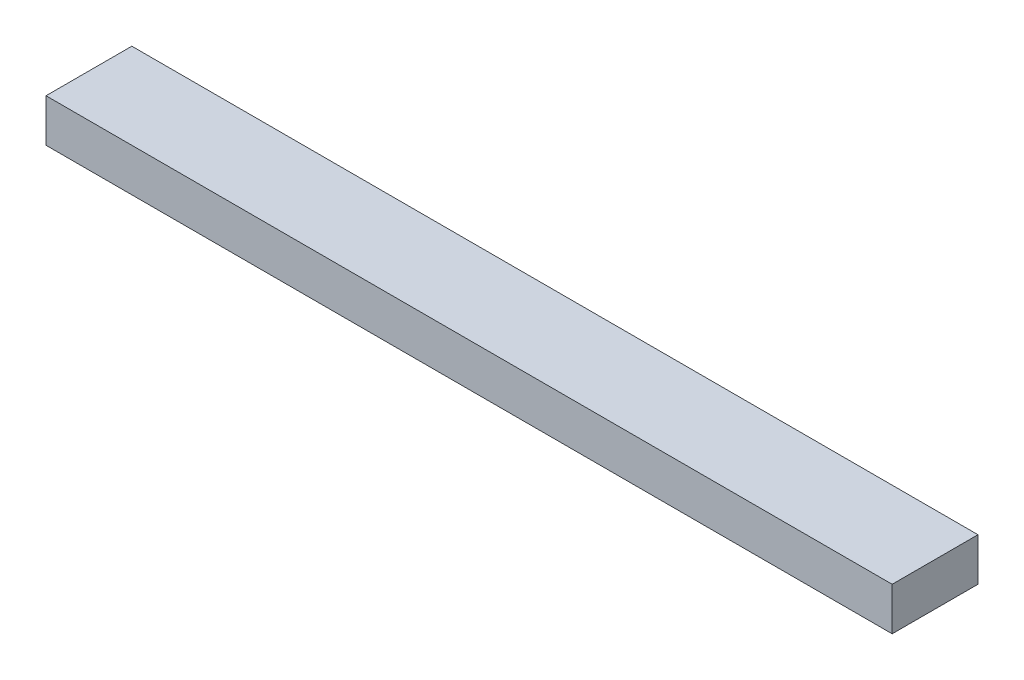
ISO-10303-21;
HEADER;
FILE_DESCRIPTION(('STEP AP214'),'2;1');
FILE_NAME('part.step','',(''),(''),'','','');
FILE_SCHEMA(('AUTOMOTIVE_DESIGN { 1 0 10303 214 1 1 1 1 }'));
ENDSEC;
DATA;
#1=APPLICATION_CONTEXT('core data for automotive mechanical design processes');
#2=APPLICATION_PROTOCOL_DEFINITION('international standard','automotive_design',2000,#1);
#3=PRODUCT_CONTEXT('',#1,'mechanical');
#4=PRODUCT('Part','Part','',(#3));
#5=PRODUCT_RELATED_PRODUCT_CATEGORY('part','',(#4));
#6=PRODUCT_DEFINITION_FORMATION('','',#4);
#7=PRODUCT_DEFINITION_CONTEXT('part definition',#1,'design');
#8=PRODUCT_DEFINITION('design','',#6,#7);
#9=PRODUCT_DEFINITION_SHAPE('','',#8);
#10=(LENGTH_UNIT() NAMED_UNIT(*) SI_UNIT(.MILLI.,.METRE.));
#11=(NAMED_UNIT(*) PLANE_ANGLE_UNIT() SI_UNIT($,.RADIAN.));
#12=(NAMED_UNIT(*) SI_UNIT($,.STERADIAN.) SOLID_ANGLE_UNIT());
#13=UNCERTAINTY_MEASURE_WITH_UNIT(LENGTH_MEASURE(1.E-05),#10,'distance_accuracy_value','');
#14=(GEOMETRIC_REPRESENTATION_CONTEXT(3) GLOBAL_UNCERTAINTY_ASSIGNED_CONTEXT((#13)) GLOBAL_UNIT_ASSIGNED_CONTEXT((#10,
#11,#12)) REPRESENTATION_CONTEXT('',''));
#15=CARTESIAN_POINT('',(0.,0.,0.));
#16=DIRECTION('',(0.,0.,1.));
#17=DIRECTION('',(1.,0.,0.));
#18=AXIS2_PLACEMENT_3D('',#15,#16,#17);
#19=CARTESIAN_POINT('',(25.04,2.54,-2.54));
#20=DIRECTION('',(-1.,0.,0.));
#21=DIRECTION('',(0.,0.,1.));
#22=AXIS2_PLACEMENT_3D('',#19,#20,#21);
#23=PLANE('',#22);
#24=DIRECTION('',(0.,0.,-1.));
#25=VECTOR('',#24,1.);
#26=CARTESIAN_POINT('',(25.04,0.,-2.54));
#27=LINE('',#26,#25);
#28=CARTESIAN_POINT('',(25.04,0.,2.54));
#29=VERTEX_POINT('',#28);
#30=CARTESIAN_POINT('',(25.04,0.,-2.54));
#31=VERTEX_POINT('',#30);
#32=EDGE_CURVE('E94',#29,#31,#27,.T.);
#33=ORIENTED_EDGE('',*,*,#32,.T.);
#34=DIRECTION('',(0.,-1.,0.));
#35=VECTOR('',#34,1.);
#36=CARTESIAN_POINT('',(25.04,2.54,-2.54));
#37=LINE('',#36,#35);
#38=CARTESIAN_POINT('',(25.04,2.54,-2.54));
#39=VERTEX_POINT('',#38);
#40=EDGE_CURVE('E11',#39,#31,#37,.T.);
#41=ORIENTED_EDGE('',*,*,#40,.F.);
#42=DIRECTION('',(0.,0.,-1.));
#43=VECTOR('',#42,1.);
#44=CARTESIAN_POINT('',(25.04,2.54,-2.54));
#45=LINE('',#44,#43);
#46=CARTESIAN_POINT('',(25.04,2.54,2.54));
#47=VERTEX_POINT('',#46);
#48=EDGE_CURVE('E82',#47,#39,#45,.T.);
#49=ORIENTED_EDGE('',*,*,#48,.F.);
#50=DIRECTION('',(0.,-1.,0.));
#51=VECTOR('',#50,1.);
#52=CARTESIAN_POINT('',(25.04,2.54,2.54));
#53=LINE('',#52,#51);
#54=EDGE_CURVE('E90',#47,#29,#53,.T.);
#55=ORIENTED_EDGE('',*,*,#54,.T.);
#56=EDGE_LOOP('',(#33,#41,#49,#55));
#57=FACE_BOUND('',#56,.T.);
#58=ADVANCED_FACE('F31',(#57),#23,.F.);
#59=CARTESIAN_POINT('',(-25.04,2.54,-2.54));
#60=DIRECTION('',(0.,0.,1.));
#61=DIRECTION('',(1.,0.,0.));
#62=AXIS2_PLACEMENT_3D('',#59,#60,#61);
#63=PLANE('',#62);
#64=DIRECTION('',(-1.,0.,0.));
#65=VECTOR('',#64,1.);
#66=CARTESIAN_POINT('',(-25.04,0.,-2.54));
#67=LINE('',#66,#65);
#68=CARTESIAN_POINT('',(-25.04,0.,-2.54));
#69=VERTEX_POINT('',#68);
#70=EDGE_CURVE('E86',#31,#69,#67,.T.);
#71=ORIENTED_EDGE('',*,*,#70,.T.);
#72=DIRECTION('',(0.,-1.,0.));
#73=VECTOR('',#72,1.);
#74=CARTESIAN_POINT('',(-25.04,2.54,-2.54));
#75=LINE('',#74,#73);
#76=CARTESIAN_POINT('',(-25.04,2.54,-2.54));
#77=VERTEX_POINT('',#76);
#78=EDGE_CURVE('E39',#77,#69,#75,.T.);
#79=ORIENTED_EDGE('',*,*,#78,.F.);
#80=DIRECTION('',(-1.,0.,0.));
#81=VECTOR('',#80,1.);
#82=CARTESIAN_POINT('',(-25.04,2.54,-2.54));
#83=LINE('',#82,#81);
#84=EDGE_CURVE('E77',#39,#77,#83,.T.);
#85=ORIENTED_EDGE('',*,*,#84,.F.);
#86=ORIENTED_EDGE('',*,*,#40,.T.);
#87=EDGE_LOOP('',(#71,#79,#85,#86));
#88=FACE_BOUND('',#87,.T.);
#89=ADVANCED_FACE('F85',(#88),#63,.F.);
#90=CARTESIAN_POINT('',(-25.04,2.54,-2.54));
#91=DIRECTION('',(1.,0.,0.));
#92=DIRECTION('',(0.,0.,-1.));
#93=AXIS2_PLACEMENT_3D('',#90,#91,#92);
#94=PLANE('',#93);
#95=DIRECTION('',(0.,0.,1.));
#96=VECTOR('',#95,1.);
#97=CARTESIAN_POINT('',(-25.04,0.,-2.54));
#98=LINE('',#97,#96);
#99=CARTESIAN_POINT('',(-25.04,0.,2.54));
#100=VERTEX_POINT('',#99);
#101=EDGE_CURVE('E64',#69,#100,#98,.T.);
#102=ORIENTED_EDGE('',*,*,#101,.T.);
#103=DIRECTION('',(0.,-1.,0.));
#104=VECTOR('',#103,1.);
#105=CARTESIAN_POINT('',(-25.04,2.54,2.54));
#106=LINE('',#105,#104);
#107=CARTESIAN_POINT('',(-25.04,2.54,2.54));
#108=VERTEX_POINT('',#107);
#109=EDGE_CURVE('E87',#108,#100,#106,.T.);
#110=ORIENTED_EDGE('',*,*,#109,.F.);
#111=DIRECTION('',(0.,0.,1.));
#112=VECTOR('',#111,1.);
#113=CARTESIAN_POINT('',(-25.04,2.54,-2.54));
#114=LINE('',#113,#112);
#115=EDGE_CURVE('E80',#77,#108,#114,.T.);
#116=ORIENTED_EDGE('',*,*,#115,.F.);
#117=ORIENTED_EDGE('',*,*,#78,.T.);
#118=EDGE_LOOP('',(#102,#110,#116,#117));
#119=FACE_BOUND('',#118,.T.);
#120=ADVANCED_FACE('F88',(#119),#94,.F.);
#121=CARTESIAN_POINT('',(-25.04,2.54,2.54));
#122=DIRECTION('',(0.,0.,-1.));
#123=DIRECTION('',(-1.,0.,0.));
#124=AXIS2_PLACEMENT_3D('',#121,#122,#123);
#125=PLANE('',#124);
#126=DIRECTION('',(1.,0.,0.));
#127=VECTOR('',#126,1.);
#128=CARTESIAN_POINT('',(-25.04,0.,2.54));
#129=LINE('',#128,#127);
#130=EDGE_CURVE('E70',#100,#29,#129,.T.);
#131=ORIENTED_EDGE('',*,*,#130,.T.);
#132=ORIENTED_EDGE('',*,*,#54,.F.);
#133=DIRECTION('',(1.,0.,0.));
#134=VECTOR('',#133,1.);
#135=CARTESIAN_POINT('',(-25.04,2.54,2.54));
#136=LINE('',#135,#134);
#137=EDGE_CURVE('E47',#108,#47,#136,.T.);
#138=ORIENTED_EDGE('',*,*,#137,.F.);
#139=ORIENTED_EDGE('',*,*,#109,.T.);
#140=EDGE_LOOP('',(#131,#132,#138,#139));
#141=FACE_BOUND('',#140,.T.);
#142=ADVANCED_FACE('F101',(#141),#125,.F.);
#143=CARTESIAN_POINT('',(25.04,2.54,2.54));
#144=DIRECTION('',(0.,1.,0.));
#145=DIRECTION('',(0.,0.,1.));
#146=AXIS2_PLACEMENT_3D('',#143,#144,#145);
#147=PLANE('',#146);
#148=ORIENTED_EDGE('',*,*,#48,.T.);
#149=ORIENTED_EDGE('',*,*,#84,.T.);
#150=ORIENTED_EDGE('',*,*,#115,.T.);
#151=ORIENTED_EDGE('',*,*,#137,.T.);
#152=EDGE_LOOP('',(#148,#149,#150,#151));
#153=FACE_BOUND('',#152,.T.);
#154=ADVANCED_FACE('F78',(#153),#147,.T.);
#155=CARTESIAN_POINT('',(25.04,0.,2.54));
#156=DIRECTION('',(0.,1.,0.));
#157=DIRECTION('',(0.,0.,1.));
#158=AXIS2_PLACEMENT_3D('',#155,#156,#157);
#159=PLANE('',#158);
#160=ORIENTED_EDGE('',*,*,#32,.F.);
#161=ORIENTED_EDGE('',*,*,#130,.F.);
#162=ORIENTED_EDGE('',*,*,#101,.F.);
#163=ORIENTED_EDGE('',*,*,#70,.F.);
#164=EDGE_LOOP('',(#160,#161,#162,#163));
#165=FACE_BOUND('',#164,.T.);
#166=ADVANCED_FACE('F104',(#165),#159,.F.);
#167=CLOSED_SHELL('',(#58,#89,#120,#142,#154,#166));
#168=MANIFOLD_SOLID_BREP('B2',#167);
#169=ADVANCED_BREP_SHAPE_REPRESENTATION('',(#18,#168),#14);
#170=SHAPE_DEFINITION_REPRESENTATION(#9,#169);
ENDSEC;
END-ISO-10303-21;
